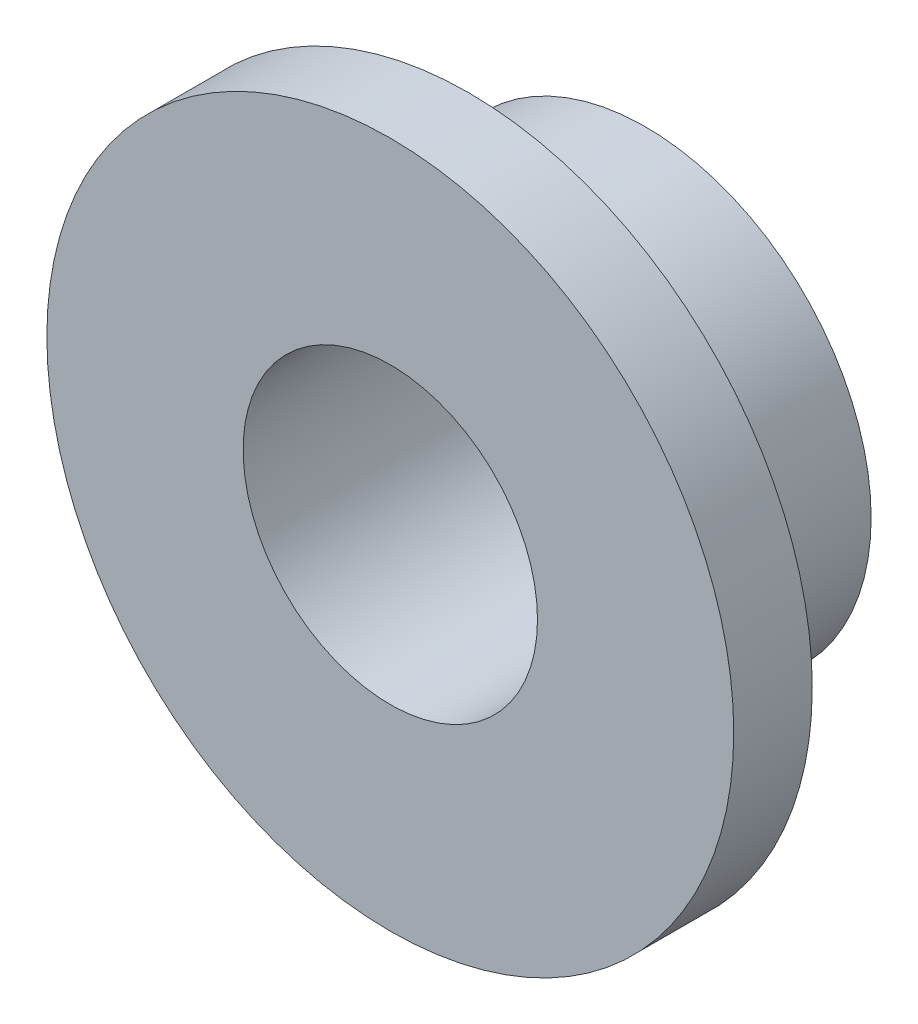
ISO-10303-21;
HEADER;
FILE_DESCRIPTION(('STEP AP214'),'2;1');
FILE_NAME('part.step','',(''),(''),'','','');
FILE_SCHEMA(('AUTOMOTIVE_DESIGN { 1 0 10303 214 1 1 1 1 }'));
ENDSEC;
DATA;
#1=APPLICATION_CONTEXT('core data for automotive mechanical design processes');
#2=APPLICATION_PROTOCOL_DEFINITION('international standard','automotive_design',2000,#1);
#3=PRODUCT_CONTEXT('',#1,'mechanical');
#4=PRODUCT('Part','Part','',(#3));
#5=PRODUCT_RELATED_PRODUCT_CATEGORY('part','',(#4));
#6=PRODUCT_DEFINITION_FORMATION('','',#4);
#7=PRODUCT_DEFINITION_CONTEXT('part definition',#1,'design');
#8=PRODUCT_DEFINITION('design','',#6,#7);
#9=PRODUCT_DEFINITION_SHAPE('','',#8);
#10=(LENGTH_UNIT() NAMED_UNIT(*) SI_UNIT(.MILLI.,.METRE.));
#11=(NAMED_UNIT(*) PLANE_ANGLE_UNIT() SI_UNIT($,.RADIAN.));
#12=(NAMED_UNIT(*) SI_UNIT($,.STERADIAN.) SOLID_ANGLE_UNIT());
#13=UNCERTAINTY_MEASURE_WITH_UNIT(LENGTH_MEASURE(1.E-05),#10,'distance_accuracy_value','');
#14=(GEOMETRIC_REPRESENTATION_CONTEXT(3) GLOBAL_UNCERTAINTY_ASSIGNED_CONTEXT((#13)) GLOBAL_UNIT_ASSIGNED_CONTEXT((#10,
#11,#12)) REPRESENTATION_CONTEXT('',''));
#15=CARTESIAN_POINT('',(0.,0.,0.));
#16=DIRECTION('',(0.,0.,1.));
#17=DIRECTION('',(1.,0.,0.));
#18=AXIS2_PLACEMENT_3D('',#15,#16,#17);
#19=CARTESIAN_POINT('',(0.,0.,0.));
#20=DIRECTION('',(0.,0.,1.));
#21=DIRECTION('',(1.,0.,0.));
#22=AXIS2_PLACEMENT_3D('',#19,#20,#21);
#23=PLANE('',#22);
#24=CARTESIAN_POINT('',(0.,0.,0.));
#25=DIRECTION('',(0.,0.,1.));
#26=DIRECTION('',(1.,0.,0.));
#27=AXIS2_PLACEMENT_3D('',#24,#25,#26);
#28=CIRCLE('',#27,11.5);
#29=CARTESIAN_POINT('',(11.5,0.,0.));
#30=VERTEX_POINT('',#29);
#31=EDGE_CURVE('E37',#30,#30,#28,.T.);
#32=ORIENTED_EDGE('',*,*,#31,.F.);
#33=EDGE_LOOP('',(#32));
#34=FACE_BOUND('',#33,.T.);
#35=CARTESIAN_POINT('',(0.,0.,0.));
#36=DIRECTION('',(0.,0.,1.));
#37=DIRECTION('',(1.,0.,0.));
#38=AXIS2_PLACEMENT_3D('',#35,#36,#37);
#39=CIRCLE('',#38,7.5);
#40=CARTESIAN_POINT('',(7.5,0.,0.));
#41=VERTEX_POINT('',#40);
#42=EDGE_CURVE('E44',#41,#41,#39,.T.);
#43=ORIENTED_EDGE('',*,*,#42,.T.);
#44=EDGE_LOOP('',(#43));
#45=FACE_BOUND('',#44,.T.);
#46=ADVANCED_FACE('F33',(#34,#45),#23,.F.);
#47=CARTESIAN_POINT('',(0.,0.,9.));
#48=DIRECTION('',(0.,0.,-1.));
#49=DIRECTION('',(-1.,0.,0.));
#50=AXIS2_PLACEMENT_3D('',#47,#48,#49);
#51=CYLINDRICAL_SURFACE('',#50,11.5);
#52=CARTESIAN_POINT('',(0.,0.,9.));
#53=DIRECTION('',(0.,0.,1.));
#54=DIRECTION('',(1.,0.,0.));
#55=AXIS2_PLACEMENT_3D('',#52,#53,#54);
#56=CIRCLE('',#55,11.5);
#57=CARTESIAN_POINT('',(11.5,0.,9.));
#58=VERTEX_POINT('',#57);
#59=EDGE_CURVE('E10',#58,#58,#56,.T.);
#60=ORIENTED_EDGE('',*,*,#59,.F.);
#61=EDGE_LOOP('',(#60));
#62=FACE_BOUND('',#61,.T.);
#63=ORIENTED_EDGE('',*,*,#31,.T.);
#64=EDGE_LOOP('',(#63));
#65=FACE_BOUND('',#64,.T.);
#66=ADVANCED_FACE('F35',(#62,#65),#51,.T.);
#67=CARTESIAN_POINT('',(0.,0.,9.));
#68=DIRECTION('',(0.,0.,-1.));
#69=DIRECTION('',(-1.,0.,0.));
#70=AXIS2_PLACEMENT_3D('',#67,#68,#69);
#71=CYLINDRICAL_SURFACE('',#70,7.5);
#72=ORIENTED_EDGE('',*,*,#42,.F.);
#73=EDGE_LOOP('',(#72));
#74=FACE_BOUND('',#73,.T.);
#75=CARTESIAN_POINT('',(0.,0.,13.));
#76=DIRECTION('',(0.,0.,1.));
#77=DIRECTION('',(1.,0.,0.));
#78=AXIS2_PLACEMENT_3D('',#75,#76,#77);
#79=CIRCLE('',#78,7.5);
#80=CARTESIAN_POINT('',(7.5,0.,13.));
#81=VERTEX_POINT('',#80);
#82=EDGE_CURVE('E52',#81,#81,#79,.T.);
#83=ORIENTED_EDGE('',*,*,#82,.T.);
#84=EDGE_LOOP('',(#83));
#85=FACE_BOUND('',#84,.T.);
#86=ADVANCED_FACE('F58',(#74,#85),#71,.F.);
#87=CARTESIAN_POINT('',(0.,0.,9.));
#88=DIRECTION('',(0.,0.,1.));
#89=DIRECTION('',(1.,0.,0.));
#90=AXIS2_PLACEMENT_3D('',#87,#88,#89);
#91=PLANE('',#90);
#92=CARTESIAN_POINT('',(0.,0.,9.));
#93=DIRECTION('',(0.,0.,1.));
#94=DIRECTION('',(1.,0.,0.));
#95=AXIS2_PLACEMENT_3D('',#92,#93,#94);
#96=CIRCLE('',#95,17.5);
#97=CARTESIAN_POINT('',(17.5,0.,9.));
#98=VERTEX_POINT('',#97);
#99=EDGE_CURVE('E49',#98,#98,#96,.T.);
#100=ORIENTED_EDGE('',*,*,#99,.F.);
#101=EDGE_LOOP('',(#100));
#102=FACE_BOUND('',#101,.T.);
#103=ORIENTED_EDGE('',*,*,#59,.T.);
#104=EDGE_LOOP('',(#103));
#105=FACE_BOUND('',#104,.T.);
#106=ADVANCED_FACE('F63',(#102,#105),#91,.F.);
#107=CARTESIAN_POINT('',(0.,0.,13.));
#108=DIRECTION('',(0.,0.,1.));
#109=DIRECTION('',(1.,0.,0.));
#110=AXIS2_PLACEMENT_3D('',#107,#108,#109);
#111=PLANE('',#110);
#112=CARTESIAN_POINT('',(0.,0.,13.));
#113=DIRECTION('',(0.,0.,1.));
#114=DIRECTION('',(1.,0.,0.));
#115=AXIS2_PLACEMENT_3D('',#112,#113,#114);
#116=CIRCLE('',#115,17.5);
#117=CARTESIAN_POINT('',(17.5,0.,13.));
#118=VERTEX_POINT('',#117);
#119=EDGE_CURVE('E48',#118,#118,#116,.T.);
#120=ORIENTED_EDGE('',*,*,#119,.T.);
#121=EDGE_LOOP('',(#120));
#122=FACE_BOUND('',#121,.T.);
#123=ORIENTED_EDGE('',*,*,#82,.F.);
#124=EDGE_LOOP('',(#123));
#125=FACE_BOUND('',#124,.T.);
#126=ADVANCED_FACE('F60',(#122,#125),#111,.T.);
#127=CARTESIAN_POINT('',(0.,0.,13.));
#128=DIRECTION('',(0.,0.,-1.));
#129=DIRECTION('',(-1.,0.,0.));
#130=AXIS2_PLACEMENT_3D('',#127,#128,#129);
#131=CYLINDRICAL_SURFACE('',#130,17.5);
#132=ORIENTED_EDGE('',*,*,#119,.F.);
#133=EDGE_LOOP('',(#132));
#134=FACE_BOUND('',#133,.T.);
#135=ORIENTED_EDGE('',*,*,#99,.T.);
#136=EDGE_LOOP('',(#135));
#137=FACE_BOUND('',#136,.T.);
#138=ADVANCED_FACE('F62',(#134,#137),#131,.T.);
#139=CLOSED_SHELL('',(#46,#66,#86,#106,#126,#138));
#140=MANIFOLD_SOLID_BREP('B2',#139);
#141=ADVANCED_BREP_SHAPE_REPRESENTATION('',(#18,#140),#14);
#142=SHAPE_DEFINITION_REPRESENTATION(#9,#141);
ENDSEC;
END-ISO-10303-21;
